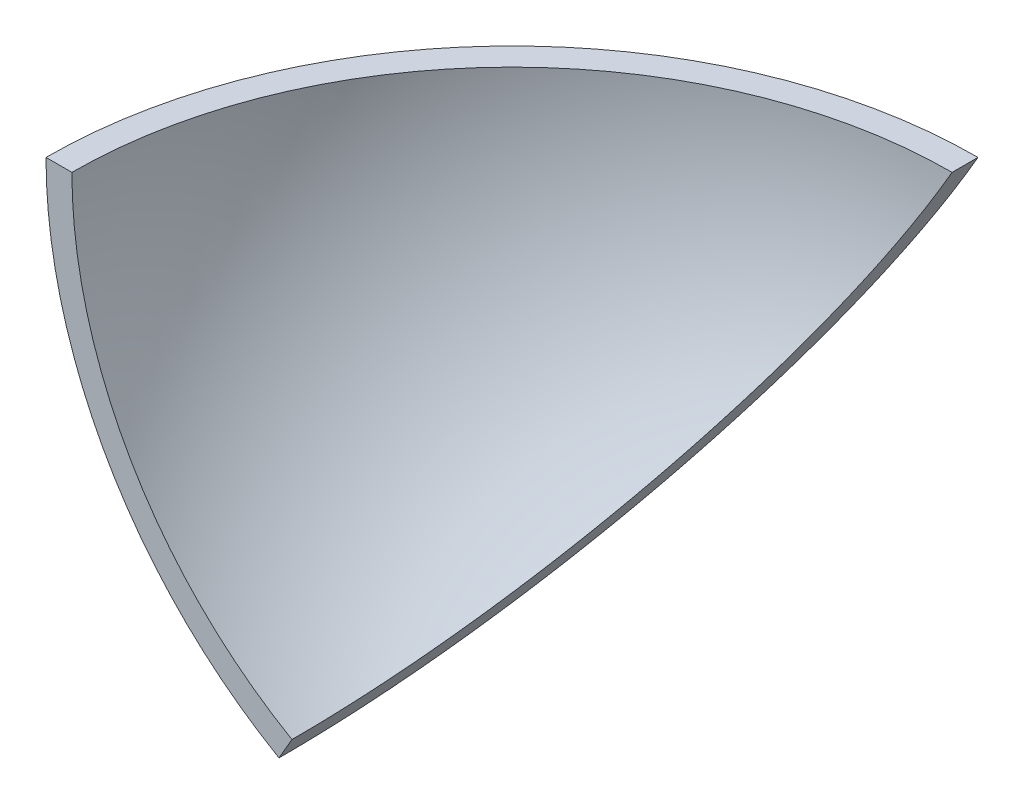
ISO-10303-21;
HEADER;
FILE_DESCRIPTION(('STEP AP214'),'2;1');
FILE_NAME('part.step','',(''),(''),'','','');
FILE_SCHEMA(('AUTOMOTIVE_DESIGN { 1 0 10303 214 1 1 1 1 }'));
ENDSEC;
DATA;
#1=APPLICATION_CONTEXT('core data for automotive mechanical design processes');
#2=APPLICATION_PROTOCOL_DEFINITION('international standard','automotive_design',2000,#1);
#3=PRODUCT_CONTEXT('',#1,'mechanical');
#4=PRODUCT('Part','Part','',(#3));
#5=PRODUCT_RELATED_PRODUCT_CATEGORY('part','',(#4));
#6=PRODUCT_DEFINITION_FORMATION('','',#4);
#7=PRODUCT_DEFINITION_CONTEXT('part definition',#1,'design');
#8=PRODUCT_DEFINITION('design','',#6,#7);
#9=PRODUCT_DEFINITION_SHAPE('','',#8);
#10=(LENGTH_UNIT() NAMED_UNIT(*) SI_UNIT(.MILLI.,.METRE.));
#11=(NAMED_UNIT(*) PLANE_ANGLE_UNIT() SI_UNIT($,.RADIAN.));
#12=(NAMED_UNIT(*) SI_UNIT($,.STERADIAN.) SOLID_ANGLE_UNIT());
#13=UNCERTAINTY_MEASURE_WITH_UNIT(LENGTH_MEASURE(1.E-05),#10,'distance_accuracy_value','');
#14=(GEOMETRIC_REPRESENTATION_CONTEXT(3) GLOBAL_UNCERTAINTY_ASSIGNED_CONTEXT((#13)) GLOBAL_UNIT_ASSIGNED_CONTEXT((#10,
#11,#12)) REPRESENTATION_CONTEXT('',''));
#15=CARTESIAN_POINT('',(0.,0.,0.));
#16=DIRECTION('',(0.,0.,1.));
#17=DIRECTION('',(1.,0.,0.));
#18=AXIS2_PLACEMENT_3D('',#15,#16,#17);
#19=CARTESIAN_POINT('',(0.,0.,0.));
#20=DIRECTION('',(-0.866025403784438,0.500000000000001,0.));
#21=DIRECTION('',(-0.500000000000001,-0.866025403784438,0.));
#22=AXIS2_PLACEMENT_3D('',#19,#20,#21);
#23=PLANE('',#22);
#24=CARTESIAN_POINT('',(0.,0.,0.));
#25=DIRECTION('',(-0.866025403784438,0.500000000000001,0.));
#26=DIRECTION('',(-0.500000000000001,-0.866025403784438,0.));
#27=AXIS2_PLACEMENT_3D('',#24,#25,#26);
#28=CIRCLE('',#27,180.);
#29=CARTESIAN_POINT('',(-90.0000000000002,-155.884572681199,0.));
#30=VERTEX_POINT('',#29);
#31=CARTESIAN_POINT('',(0.,0.,-180.));
#32=VERTEX_POINT('',#31);
#33=EDGE_CURVE('E86',#30,#32,#28,.F.);
#34=ORIENTED_EDGE('',*,*,#33,.T.);
#35=DIRECTION('',(0.,0.,1.));
#36=VECTOR('',#35,1.);
#37=CARTESIAN_POINT('',(0.,0.,0.));
#38=LINE('',#37,#36);
#39=CARTESIAN_POINT('',(0.,0.,-170.));
#40=VERTEX_POINT('',#39);
#41=EDGE_CURVE('E39',#32,#40,#38,.T.);
#42=ORIENTED_EDGE('',*,*,#41,.T.);
#43=CARTESIAN_POINT('',(0.,0.,0.));
#44=DIRECTION('',(-0.866025403784438,0.500000000000001,0.));
#45=DIRECTION('',(-0.500000000000001,-0.866025403784438,0.));
#46=AXIS2_PLACEMENT_3D('',#43,#44,#45);
#47=CIRCLE('',#46,170.);
#48=CARTESIAN_POINT('',(-85.0000000000002,-147.224318643355,0.));
#49=VERTEX_POINT('',#48);
#50=EDGE_CURVE('E72',#40,#49,#47,.T.);
#51=ORIENTED_EDGE('',*,*,#50,.T.);
#52=DIRECTION('',(-0.500000000000001,-0.866025403784438,0.));
#53=VECTOR('',#52,1.);
#54=CARTESIAN_POINT('',(0.,0.,0.));
#55=LINE('',#54,#53);
#56=EDGE_CURVE('E58',#49,#30,#55,.T.);
#57=ORIENTED_EDGE('',*,*,#56,.T.);
#58=EDGE_LOOP('',(#34,#42,#51,#57));
#59=FACE_BOUND('',#58,.T.);
#60=ADVANCED_FACE('F35',(#59),#23,.F.);
#61=CARTESIAN_POINT('',(0.,0.,0.));
#62=DIRECTION('',(0.,0.,1.));
#63=DIRECTION('',(1.,0.,0.));
#64=AXIS2_PLACEMENT_3D('',#61,#62,#63);
#65=PLANE('',#64);
#66=CARTESIAN_POINT('',(0.,0.,0.));
#67=DIRECTION('',(0.,0.,1.));
#68=DIRECTION('',(1.,0.,0.));
#69=AXIS2_PLACEMENT_3D('',#66,#67,#68);
#70=CIRCLE('',#69,180.);
#71=CARTESIAN_POINT('',(-180.,0.,0.));
#72=VERTEX_POINT('',#71);
#73=EDGE_CURVE('E74',#30,#72,#70,.F.);
#74=ORIENTED_EDGE('',*,*,#73,.F.);
#75=ORIENTED_EDGE('',*,*,#56,.F.);
#76=CARTESIAN_POINT('',(0.,0.,0.));
#77=DIRECTION('',(0.,0.,1.));
#78=DIRECTION('',(1.,0.,0.));
#79=AXIS2_PLACEMENT_3D('',#76,#77,#78);
#80=CIRCLE('',#79,170.);
#81=CARTESIAN_POINT('',(-170.,0.,0.));
#82=VERTEX_POINT('',#81);
#83=EDGE_CURVE('E11',#82,#49,#80,.T.);
#84=ORIENTED_EDGE('',*,*,#83,.F.);
#85=DIRECTION('',(-1.,0.,0.));
#86=VECTOR('',#85,1.);
#87=CARTESIAN_POINT('',(0.,0.,0.));
#88=LINE('',#87,#86);
#89=EDGE_CURVE('E80',#82,#72,#88,.T.);
#90=ORIENTED_EDGE('',*,*,#89,.T.);
#91=EDGE_LOOP('',(#74,#75,#84,#90));
#92=FACE_BOUND('',#91,.T.);
#93=ADVANCED_FACE('F79',(#92),#65,.T.);
#94=CARTESIAN_POINT('',(0.,0.,0.));
#95=DIRECTION('',(0.,1.,0.));
#96=DIRECTION('',(0.,0.,1.));
#97=AXIS2_PLACEMENT_3D('',#94,#95,#96);
#98=PLANE('',#97);
#99=CARTESIAN_POINT('',(0.,0.,0.));
#100=DIRECTION('',(0.,1.,0.));
#101=DIRECTION('',(0.,0.,1.));
#102=AXIS2_PLACEMENT_3D('',#99,#100,#101);
#103=CIRCLE('',#102,180.);
#104=EDGE_CURVE('E83',#72,#32,#103,.F.);
#105=ORIENTED_EDGE('',*,*,#104,.F.);
#106=ORIENTED_EDGE('',*,*,#89,.F.);
#107=CARTESIAN_POINT('',(0.,0.,0.));
#108=DIRECTION('',(0.,1.,0.));
#109=DIRECTION('',(0.,0.,1.));
#110=AXIS2_PLACEMENT_3D('',#107,#108,#109);
#111=CIRCLE('',#110,170.);
#112=EDGE_CURVE('E44',#40,#82,#111,.T.);
#113=ORIENTED_EDGE('',*,*,#112,.F.);
#114=ORIENTED_EDGE('',*,*,#41,.F.);
#115=EDGE_LOOP('',(#105,#106,#113,#114));
#116=FACE_BOUND('',#115,.T.);
#117=ADVANCED_FACE('F81',(#116),#98,.T.);
#118=CARTESIAN_POINT('',(0.,0.,0.));
#119=DIRECTION('',(0.,1.,0.));
#120=DIRECTION('',(1.,0.,0.));
#121=AXIS2_PLACEMENT_3D('',#118,#119,#120);
#122=SPHERICAL_SURFACE('',#121,170.);
#123=ORIENTED_EDGE('',*,*,#50,.F.);
#124=ORIENTED_EDGE('',*,*,#112,.T.);
#125=ORIENTED_EDGE('',*,*,#83,.T.);
#126=EDGE_LOOP('',(#123,#124,#125));
#127=FACE_BOUND('',#126,.T.);
#128=ADVANCED_FACE('F71',(#127),#122,.F.);
#129=CARTESIAN_POINT('',(0.,0.,0.));
#130=DIRECTION('',(0.,1.,0.));
#131=DIRECTION('',(1.,0.,0.));
#132=AXIS2_PLACEMENT_3D('',#129,#130,#131);
#133=SPHERICAL_SURFACE('',#132,180.);
#134=ORIENTED_EDGE('',*,*,#73,.T.);
#135=ORIENTED_EDGE('',*,*,#104,.T.);
#136=ORIENTED_EDGE('',*,*,#33,.F.);
#137=EDGE_LOOP('',(#134,#135,#136));
#138=FACE_BOUND('',#137,.T.);
#139=ADVANCED_FACE('F37',(#138),#133,.T.);
#140=CLOSED_SHELL('',(#60,#93,#117,#128,#139));
#141=MANIFOLD_SOLID_BREP('B2',#140);
#142=ADVANCED_BREP_SHAPE_REPRESENTATION('',(#18,#141),#14);
#143=SHAPE_DEFINITION_REPRESENTATION(#9,#142);
ENDSEC;
END-ISO-10303-21;
